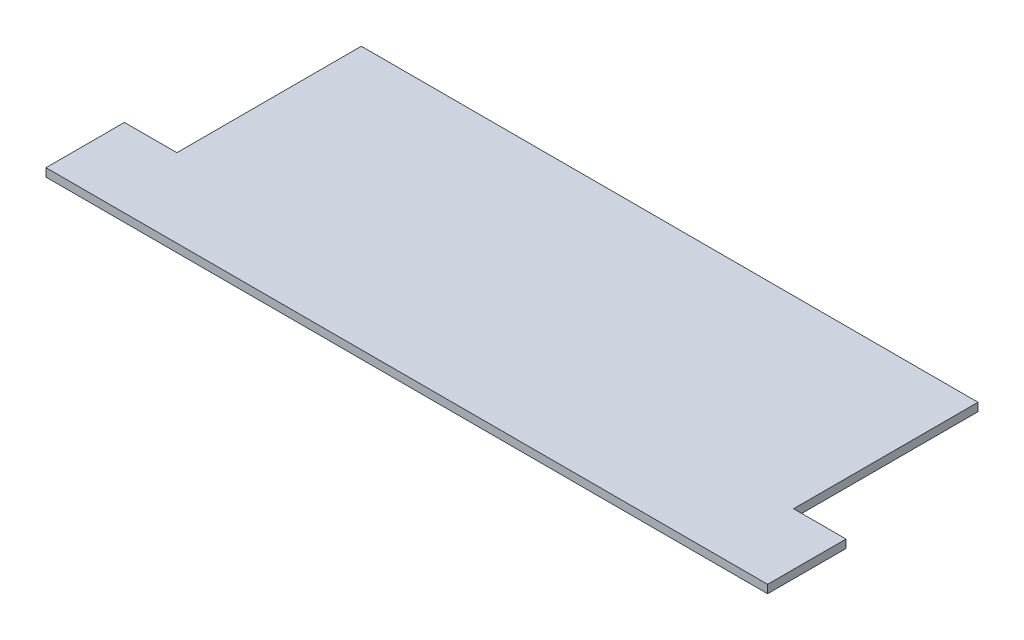
ISO-10303-21;
HEADER;
FILE_DESCRIPTION(('STEP AP214'),'2;1');
FILE_NAME('part.step','',(''),(''),'','','');
FILE_SCHEMA(('AUTOMOTIVE_DESIGN { 1 0 10303 214 1 1 1 1 }'));
ENDSEC;
DATA;
#1=APPLICATION_CONTEXT('core data for automotive mechanical design processes');
#2=APPLICATION_PROTOCOL_DEFINITION('international standard','automotive_design',2000,#1);
#3=PRODUCT_CONTEXT('',#1,'mechanical');
#4=PRODUCT('Part','Part','',(#3));
#5=PRODUCT_RELATED_PRODUCT_CATEGORY('part','',(#4));
#6=PRODUCT_DEFINITION_FORMATION('','',#4);
#7=PRODUCT_DEFINITION_CONTEXT('part definition',#1,'design');
#8=PRODUCT_DEFINITION('design','',#6,#7);
#9=PRODUCT_DEFINITION_SHAPE('','',#8);
#10=(LENGTH_UNIT() NAMED_UNIT(*) SI_UNIT(.MILLI.,.METRE.));
#11=(NAMED_UNIT(*) PLANE_ANGLE_UNIT() SI_UNIT($,.RADIAN.));
#12=(NAMED_UNIT(*) SI_UNIT($,.STERADIAN.) SOLID_ANGLE_UNIT());
#13=UNCERTAINTY_MEASURE_WITH_UNIT(LENGTH_MEASURE(1.E-05),#10,'distance_accuracy_value','');
#14=(GEOMETRIC_REPRESENTATION_CONTEXT(3) GLOBAL_UNCERTAINTY_ASSIGNED_CONTEXT((#13)) GLOBAL_UNIT_ASSIGNED_CONTEXT((#10,
#11,#12)) REPRESENTATION_CONTEXT('',''));
#15=CARTESIAN_POINT('',(0.,0.,0.));
#16=DIRECTION('',(0.,0.,1.));
#17=DIRECTION('',(1.,0.,0.));
#18=AXIS2_PLACEMENT_3D('',#15,#16,#17);
#19=CARTESIAN_POINT('',(0.,31.75,0.));
#20=DIRECTION('',(0.,1.,0.));
#21=DIRECTION('',(0.,0.,1.));
#22=AXIS2_PLACEMENT_3D('',#19,#20,#21);
#23=PLANE('',#22);
#24=DIRECTION('',(-1.,0.,0.));
#25=VECTOR('',#24,1.);
#26=CARTESIAN_POINT('',(59.69,31.75,-30.9721313550851));
#27=LINE('',#26,#25);
#28=CARTESIAN_POINT('',(69.85,31.75,-30.9721313550851));
#29=VERTEX_POINT('',#28);
#30=CARTESIAN_POINT('',(59.69,31.75,-30.9721313550851));
#31=VERTEX_POINT('',#30);
#32=EDGE_CURVE('E129',#29,#31,#27,.T.);
#33=ORIENTED_EDGE('',*,*,#32,.F.);
#34=DIRECTION('',(0.,0.,-1.));
#35=VECTOR('',#34,1.);
#36=CARTESIAN_POINT('',(69.85,31.75,-15.7909416031388));
#37=LINE('',#36,#35);
#38=CARTESIAN_POINT('',(69.85,31.75,-15.7909416031388));
#39=VERTEX_POINT('',#38);
#40=EDGE_CURVE('E84',#39,#29,#37,.T.);
#41=ORIENTED_EDGE('',*,*,#40,.F.);
#42=DIRECTION('',(1.,0.,0.));
#43=VECTOR('',#42,1.);
#44=CARTESIAN_POINT('',(-69.85,31.75,-15.7909416031388));
#45=LINE('',#44,#43);
#46=CARTESIAN_POINT('',(-69.85,31.75,-15.7909416031388));
#47=VERTEX_POINT('',#46);
#48=EDGE_CURVE('E78',#47,#39,#45,.T.);
#49=ORIENTED_EDGE('',*,*,#48,.F.);
#50=DIRECTION('',(0.,0.,1.));
#51=VECTOR('',#50,1.);
#52=CARTESIAN_POINT('',(-69.85,31.75,-15.7909416031388));
#53=LINE('',#52,#51);
#54=CARTESIAN_POINT('',(-69.85,31.75,-30.9721313550851));
#55=VERTEX_POINT('',#54);
#56=EDGE_CURVE('E119',#55,#47,#53,.T.);
#57=ORIENTED_EDGE('',*,*,#56,.F.);
#58=DIRECTION('',(-1.,0.,0.));
#59=VECTOR('',#58,1.);
#60=CARTESIAN_POINT('',(-59.69,31.75,-30.9721313550851));
#61=LINE('',#60,#59);
#62=CARTESIAN_POINT('',(-59.69,31.75,-30.9721313550851));
#63=VERTEX_POINT('',#62);
#64=EDGE_CURVE('E138',#63,#55,#61,.T.);
#65=ORIENTED_EDGE('',*,*,#64,.F.);
#66=DIRECTION('',(0.,0.,1.));
#67=VECTOR('',#66,1.);
#68=CARTESIAN_POINT('',(-59.69,31.75,-66.675));
#69=LINE('',#68,#67);
#70=CARTESIAN_POINT('',(-59.69,31.75,-66.675));
#71=VERTEX_POINT('',#70);
#72=EDGE_CURVE('E136',#71,#63,#69,.T.);
#73=ORIENTED_EDGE('',*,*,#72,.F.);
#74=DIRECTION('',(-1.,0.,0.));
#75=VECTOR('',#74,1.);
#76=CARTESIAN_POINT('',(59.69,31.75,-66.675));
#77=LINE('',#76,#75);
#78=CARTESIAN_POINT('',(59.69,31.75,-66.675));
#79=VERTEX_POINT('',#78);
#80=EDGE_CURVE('E134',#79,#71,#77,.T.);
#81=ORIENTED_EDGE('',*,*,#80,.F.);
#82=DIRECTION('',(0.,0.,-1.));
#83=VECTOR('',#82,1.);
#84=CARTESIAN_POINT('',(59.69,31.75,-30.9721313550851));
#85=LINE('',#84,#83);
#86=EDGE_CURVE('E132',#31,#79,#85,.T.);
#87=ORIENTED_EDGE('',*,*,#86,.F.);
#88=EDGE_LOOP('',(#33,#41,#49,#57,#65,#73,#81,#87));
#89=FACE_BOUND('',#88,.T.);
#90=ADVANCED_FACE('F32',(#89),#23,.F.);
#91=CARTESIAN_POINT('',(69.85,33.3375,-15.7909416031388));
#92=DIRECTION('',(-1.,0.,0.));
#93=DIRECTION('',(0.,0.,1.));
#94=AXIS2_PLACEMENT_3D('',#91,#92,#93);
#95=PLANE('',#94);
#96=ORIENTED_EDGE('',*,*,#40,.T.);
#97=DIRECTION('',(0.,-1.,0.));
#98=VECTOR('',#97,1.);
#99=CARTESIAN_POINT('',(69.85,33.3375,-30.9721313550851));
#100=LINE('',#99,#98);
#101=CARTESIAN_POINT('',(69.85,33.3375,-30.9721313550851));
#102=VERTEX_POINT('',#101);
#103=EDGE_CURVE('E125',#102,#29,#100,.T.);
#104=ORIENTED_EDGE('',*,*,#103,.F.);
#105=DIRECTION('',(0.,0.,-1.));
#106=VECTOR('',#105,1.);
#107=CARTESIAN_POINT('',(69.85,33.3375,-15.7909416031388));
#108=LINE('',#107,#106);
#109=CARTESIAN_POINT('',(69.85,33.3375,-15.7909416031388));
#110=VERTEX_POINT('',#109);
#111=EDGE_CURVE('E49',#110,#102,#108,.T.);
#112=ORIENTED_EDGE('',*,*,#111,.F.);
#113=DIRECTION('',(0.,-1.,0.));
#114=VECTOR('',#113,1.);
#115=CARTESIAN_POINT('',(69.85,33.3375,-15.7909416031388));
#116=LINE('',#115,#114);
#117=EDGE_CURVE('E121',#110,#39,#116,.T.);
#118=ORIENTED_EDGE('',*,*,#117,.T.);
#119=EDGE_LOOP('',(#96,#104,#112,#118));
#120=FACE_BOUND('',#119,.T.);
#121=ADVANCED_FACE('F184',(#120),#95,.F.);
#122=CARTESIAN_POINT('',(-69.85,33.3375,-15.7909416031388));
#123=DIRECTION('',(0.,0.,-1.));
#124=DIRECTION('',(-1.,0.,0.));
#125=AXIS2_PLACEMENT_3D('',#122,#123,#124);
#126=PLANE('',#125);
#127=ORIENTED_EDGE('',*,*,#48,.T.);
#128=ORIENTED_EDGE('',*,*,#117,.F.);
#129=DIRECTION('',(1.,0.,0.));
#130=VECTOR('',#129,1.);
#131=CARTESIAN_POINT('',(-69.85,33.3375,-15.7909416031388));
#132=LINE('',#131,#130);
#133=CARTESIAN_POINT('',(-69.85,33.3375,-15.7909416031388));
#134=VERTEX_POINT('',#133);
#135=EDGE_CURVE('E109',#134,#110,#132,.T.);
#136=ORIENTED_EDGE('',*,*,#135,.F.);
#137=DIRECTION('',(0.,-1.,0.));
#138=VECTOR('',#137,1.);
#139=CARTESIAN_POINT('',(-69.85,33.3375,-15.7909416031388));
#140=LINE('',#139,#138);
#141=EDGE_CURVE('E116',#134,#47,#140,.T.);
#142=ORIENTED_EDGE('',*,*,#141,.T.);
#143=EDGE_LOOP('',(#127,#128,#136,#142));
#144=FACE_BOUND('',#143,.T.);
#145=ADVANCED_FACE('F123',(#144),#126,.F.);
#146=CARTESIAN_POINT('',(-69.85,33.3375,-15.7909416031388));
#147=DIRECTION('',(1.,0.,0.));
#148=DIRECTION('',(0.,0.,-1.));
#149=AXIS2_PLACEMENT_3D('',#146,#147,#148);
#150=PLANE('',#149);
#151=ORIENTED_EDGE('',*,*,#56,.T.);
#152=ORIENTED_EDGE('',*,*,#141,.F.);
#153=DIRECTION('',(0.,0.,1.));
#154=VECTOR('',#153,1.);
#155=CARTESIAN_POINT('',(-69.85,33.3375,-15.7909416031388));
#156=LINE('',#155,#154);
#157=CARTESIAN_POINT('',(-69.85,33.3375,-30.9721313550851));
#158=VERTEX_POINT('',#157);
#159=EDGE_CURVE('E105',#158,#134,#156,.T.);
#160=ORIENTED_EDGE('',*,*,#159,.F.);
#161=DIRECTION('',(0.,-1.,0.));
#162=VECTOR('',#161,1.);
#163=CARTESIAN_POINT('',(-69.85,33.3375,-30.9721313550851));
#164=LINE('',#163,#162);
#165=EDGE_CURVE('E120',#158,#55,#164,.T.);
#166=ORIENTED_EDGE('',*,*,#165,.T.);
#167=EDGE_LOOP('',(#151,#152,#160,#166));
#168=FACE_BOUND('',#167,.T.);
#169=ADVANCED_FACE('F117',(#168),#150,.F.);
#170=CARTESIAN_POINT('',(-59.69,33.3375,-30.9721313550851));
#171=DIRECTION('',(0.,0.,1.));
#172=DIRECTION('',(1.,0.,0.));
#173=AXIS2_PLACEMENT_3D('',#170,#171,#172);
#174=PLANE('',#173);
#175=ORIENTED_EDGE('',*,*,#64,.T.);
#176=ORIENTED_EDGE('',*,*,#165,.F.);
#177=DIRECTION('',(-1.,0.,0.));
#178=VECTOR('',#177,1.);
#179=CARTESIAN_POINT('',(-59.69,33.3375,-30.9721313550851));
#180=LINE('',#179,#178);
#181=CARTESIAN_POINT('',(-59.69,33.3375,-30.9721313550851));
#182=VERTEX_POINT('',#181);
#183=EDGE_CURVE('E111',#182,#158,#180,.T.);
#184=ORIENTED_EDGE('',*,*,#183,.F.);
#185=DIRECTION('',(0.,-1.,0.));
#186=VECTOR('',#185,1.);
#187=CARTESIAN_POINT('',(-59.69,33.3375,-30.9721313550851));
#188=LINE('',#187,#186);
#189=EDGE_CURVE('E147',#182,#63,#188,.T.);
#190=ORIENTED_EDGE('',*,*,#189,.T.);
#191=EDGE_LOOP('',(#175,#176,#184,#190));
#192=FACE_BOUND('',#191,.T.);
#193=ADVANCED_FACE('F168',(#192),#174,.F.);
#194=CARTESIAN_POINT('',(-59.69,33.3375,-66.675));
#195=DIRECTION('',(1.,0.,0.));
#196=DIRECTION('',(0.,0.,-1.));
#197=AXIS2_PLACEMENT_3D('',#194,#195,#196);
#198=PLANE('',#197);
#199=ORIENTED_EDGE('',*,*,#72,.T.);
#200=ORIENTED_EDGE('',*,*,#189,.F.);
#201=DIRECTION('',(0.,0.,1.));
#202=VECTOR('',#201,1.);
#203=CARTESIAN_POINT('',(-59.69,33.3375,-66.675));
#204=LINE('',#203,#202);
#205=CARTESIAN_POINT('',(-59.69,33.3375,-66.675));
#206=VERTEX_POINT('',#205);
#207=EDGE_CURVE('E169',#206,#182,#204,.T.);
#208=ORIENTED_EDGE('',*,*,#207,.F.);
#209=DIRECTION('',(0.,-1.,0.));
#210=VECTOR('',#209,1.);
#211=CARTESIAN_POINT('',(-59.69,33.3375,-66.675));
#212=LINE('',#211,#210);
#213=EDGE_CURVE('E150',#206,#71,#212,.T.);
#214=ORIENTED_EDGE('',*,*,#213,.T.);
#215=EDGE_LOOP('',(#199,#200,#208,#214));
#216=FACE_BOUND('',#215,.T.);
#217=ADVANCED_FACE('F165',(#216),#198,.F.);
#218=CARTESIAN_POINT('',(59.69,33.3375,-30.9721313550851));
#219=DIRECTION('',(0.,0.,1.));
#220=DIRECTION('',(1.,0.,0.));
#221=AXIS2_PLACEMENT_3D('',#218,#219,#220);
#222=PLANE('',#221);
#223=ORIENTED_EDGE('',*,*,#32,.T.);
#224=DIRECTION('',(0.,-1.,0.));
#225=VECTOR('',#224,1.);
#226=CARTESIAN_POINT('',(59.69,33.3375,-30.9721313550851));
#227=LINE('',#226,#225);
#228=CARTESIAN_POINT('',(59.69,33.3375,-30.9721313550851));
#229=VERTEX_POINT('',#228);
#230=EDGE_CURVE('E11',#229,#31,#227,.T.);
#231=ORIENTED_EDGE('',*,*,#230,.F.);
#232=DIRECTION('',(-1.,0.,0.));
#233=VECTOR('',#232,1.);
#234=CARTESIAN_POINT('',(59.69,33.3375,-30.9721313550851));
#235=LINE('',#234,#233);
#236=EDGE_CURVE('E143',#102,#229,#235,.T.);
#237=ORIENTED_EDGE('',*,*,#236,.F.);
#238=ORIENTED_EDGE('',*,*,#103,.T.);
#239=EDGE_LOOP('',(#223,#231,#237,#238));
#240=FACE_BOUND('',#239,.T.);
#241=ADVANCED_FACE('F34',(#240),#222,.F.);
#242=CARTESIAN_POINT('',(0.,33.3375,0.));
#243=DIRECTION('',(0.,1.,0.));
#244=DIRECTION('',(0.,0.,1.));
#245=AXIS2_PLACEMENT_3D('',#242,#243,#244);
#246=PLANE('',#245);
#247=ORIENTED_EDGE('',*,*,#236,.T.);
#248=DIRECTION('',(0.,0.,-1.));
#249=VECTOR('',#248,1.);
#250=CARTESIAN_POINT('',(59.69,33.3375,-30.9721313550851));
#251=LINE('',#250,#249);
#252=CARTESIAN_POINT('',(59.69,33.3375,-66.675));
#253=VERTEX_POINT('',#252);
#254=EDGE_CURVE('E92',#229,#253,#251,.T.);
#255=ORIENTED_EDGE('',*,*,#254,.T.);
#256=DIRECTION('',(-1.,0.,0.));
#257=VECTOR('',#256,1.);
#258=CARTESIAN_POINT('',(59.69,33.3375,-66.675));
#259=LINE('',#258,#257);
#260=EDGE_CURVE('E158',#253,#206,#259,.T.);
#261=ORIENTED_EDGE('',*,*,#260,.T.);
#262=ORIENTED_EDGE('',*,*,#207,.T.);
#263=ORIENTED_EDGE('',*,*,#183,.T.);
#264=ORIENTED_EDGE('',*,*,#159,.T.);
#265=ORIENTED_EDGE('',*,*,#135,.T.);
#266=ORIENTED_EDGE('',*,*,#111,.T.);
#267=EDGE_LOOP('',(#247,#255,#261,#262,#263,#264,#265,#266));
#268=FACE_BOUND('',#267,.T.);
#269=ADVANCED_FACE('F107',(#268),#246,.T.);
#270=CARTESIAN_POINT('',(59.69,33.3375,-66.675));
#271=DIRECTION('',(0.,0.,1.));
#272=DIRECTION('',(1.,0.,0.));
#273=AXIS2_PLACEMENT_3D('',#270,#271,#272);
#274=PLANE('',#273);
#275=ORIENTED_EDGE('',*,*,#80,.T.);
#276=ORIENTED_EDGE('',*,*,#213,.F.);
#277=ORIENTED_EDGE('',*,*,#260,.F.);
#278=DIRECTION('',(0.,-1.,0.));
#279=VECTOR('',#278,1.);
#280=CARTESIAN_POINT('',(59.69,33.3375,-66.675));
#281=LINE('',#280,#279);
#282=EDGE_CURVE('E41',#253,#79,#281,.T.);
#283=ORIENTED_EDGE('',*,*,#282,.T.);
#284=EDGE_LOOP('',(#275,#276,#277,#283));
#285=FACE_BOUND('',#284,.T.);
#286=ADVANCED_FACE('F156',(#285),#274,.F.);
#287=CARTESIAN_POINT('',(59.69,33.3375,-30.9721313550851));
#288=DIRECTION('',(-1.,0.,0.));
#289=DIRECTION('',(0.,0.,1.));
#290=AXIS2_PLACEMENT_3D('',#287,#288,#289);
#291=PLANE('',#290);
#292=ORIENTED_EDGE('',*,*,#86,.T.);
#293=ORIENTED_EDGE('',*,*,#282,.F.);
#294=ORIENTED_EDGE('',*,*,#254,.F.);
#295=ORIENTED_EDGE('',*,*,#230,.T.);
#296=EDGE_LOOP('',(#292,#293,#294,#295));
#297=FACE_BOUND('',#296,.T.);
#298=ADVANCED_FACE('F177',(#297),#291,.F.);
#299=CLOSED_SHELL('',(#90,#121,#145,#169,#193,#217,#241,#269,#286,#298));
#300=MANIFOLD_SOLID_BREP('B2',#299);
#301=ADVANCED_BREP_SHAPE_REPRESENTATION('',(#18,#300),#14);
#302=SHAPE_DEFINITION_REPRESENTATION(#9,#301);
ENDSEC;
END-ISO-10303-21;
